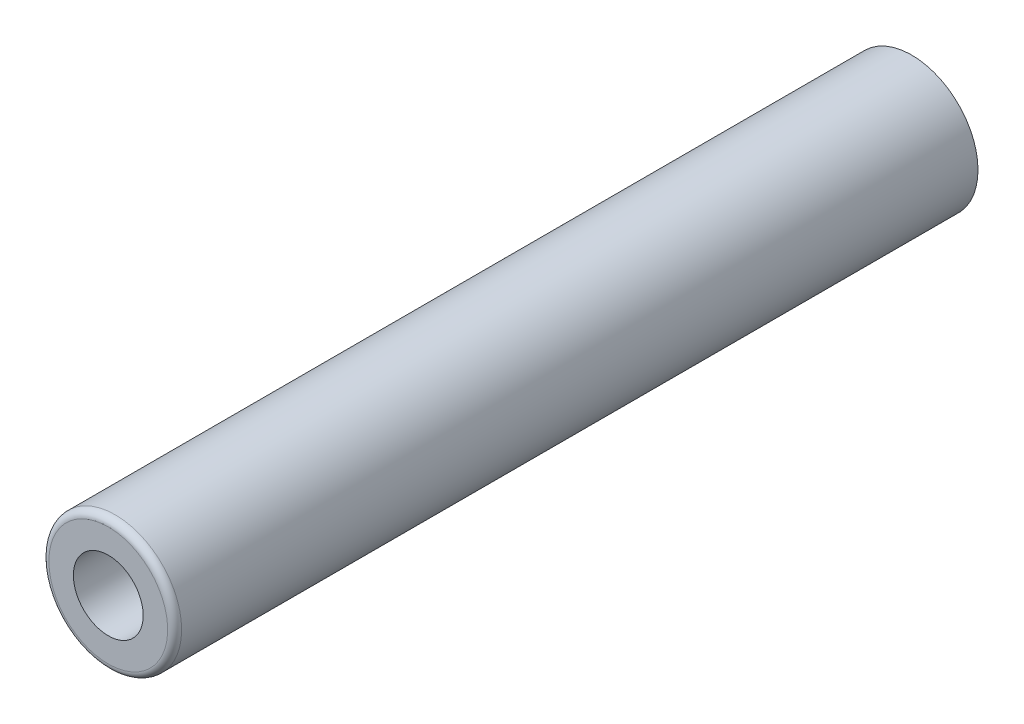
ISO-10303-21;
HEADER;
FILE_DESCRIPTION(('STEP AP214'),'2;1');
FILE_NAME('part.step','',(''),(''),'','','');
FILE_SCHEMA(('AUTOMOTIVE_DESIGN { 1 0 10303 214 1 1 1 1 }'));
ENDSEC;
DATA;
#1=APPLICATION_CONTEXT('core data for automotive mechanical design processes');
#2=APPLICATION_PROTOCOL_DEFINITION('international standard','automotive_design',2000,#1);
#3=PRODUCT_CONTEXT('',#1,'mechanical');
#4=PRODUCT('Part','Part','',(#3));
#5=PRODUCT_RELATED_PRODUCT_CATEGORY('part','',(#4));
#6=PRODUCT_DEFINITION_FORMATION('','',#4);
#7=PRODUCT_DEFINITION_CONTEXT('part definition',#1,'design');
#8=PRODUCT_DEFINITION('design','',#6,#7);
#9=PRODUCT_DEFINITION_SHAPE('','',#8);
#10=(LENGTH_UNIT() NAMED_UNIT(*) SI_UNIT(.MILLI.,.METRE.));
#11=(NAMED_UNIT(*) PLANE_ANGLE_UNIT() SI_UNIT($,.RADIAN.));
#12=(NAMED_UNIT(*) SI_UNIT($,.STERADIAN.) SOLID_ANGLE_UNIT());
#13=UNCERTAINTY_MEASURE_WITH_UNIT(LENGTH_MEASURE(1.E-05),#10,'distance_accuracy_value','');
#14=(GEOMETRIC_REPRESENTATION_CONTEXT(3) GLOBAL_UNCERTAINTY_ASSIGNED_CONTEXT((#13)) GLOBAL_UNIT_ASSIGNED_CONTEXT((#10,
#11,#12)) REPRESENTATION_CONTEXT('',''));
#15=CARTESIAN_POINT('',(0.,0.,0.));
#16=DIRECTION('',(0.,0.,1.));
#17=DIRECTION('',(1.,0.,0.));
#18=AXIS2_PLACEMENT_3D('',#15,#16,#17);
#19=CARTESIAN_POINT('',(0.,0.,319.317365215732));
#20=DIRECTION('',(0.,0.,1.));
#21=DIRECTION('',(1.,0.,0.));
#22=AXIS2_PLACEMENT_3D('',#19,#20,#21);
#23=CYLINDRICAL_SURFACE('',#22,19.0000000000001);
#24=CARTESIAN_POINT('',(0.,0.,113.));
#25=DIRECTION('',(0.,0.,-1.));
#26=DIRECTION('',(-1.,0.,0.));
#27=AXIS2_PLACEMENT_3D('',#24,#25,#26);
#28=CIRCLE('',#27,19.0000000000001);
#29=CARTESIAN_POINT('',(-19.0000000000001,0.,113.));
#30=VERTEX_POINT('',#29);
#31=EDGE_CURVE('E10',#30,#30,#28,.T.);
#32=ORIENTED_EDGE('',*,*,#31,.T.);
#33=EDGE_LOOP('',(#32));
#34=FACE_BOUND('',#33,.T.);
#35=CARTESIAN_POINT('',(0.,0.,-115.));
#36=DIRECTION('',(0.,0.,1.));
#37=DIRECTION('',(1.,0.,0.));
#38=AXIS2_PLACEMENT_3D('',#35,#36,#37);
#39=CIRCLE('',#38,19.0000000000001);
#40=CARTESIAN_POINT('',(19.0000000000001,0.,-115.));
#41=VERTEX_POINT('',#40);
#42=EDGE_CURVE('E49',#41,#41,#39,.T.);
#43=ORIENTED_EDGE('',*,*,#42,.T.);
#44=EDGE_LOOP('',(#43));
#45=FACE_BOUND('',#44,.T.);
#46=ADVANCED_FACE('F39',(#34,#45),#23,.T.);
#47=CARTESIAN_POINT('',(0.,19.0000000000001,-115.));
#48=DIRECTION('',(0.,0.,1.));
#49=DIRECTION('',(1.,0.,0.));
#50=AXIS2_PLACEMENT_3D('',#47,#48,#49);
#51=PLANE('',#50);
#52=ORIENTED_EDGE('',*,*,#42,.F.);
#53=EDGE_LOOP('',(#52));
#54=FACE_BOUND('',#53,.T.);
#55=CARTESIAN_POINT('',(0.,0.,-115.));
#56=DIRECTION('',(0.,0.,1.));
#57=DIRECTION('',(1.,0.,0.));
#58=AXIS2_PLACEMENT_3D('',#55,#56,#57);
#59=CIRCLE('',#58,15.0000000000001);
#60=CARTESIAN_POINT('',(15.0000000000001,0.,-115.));
#61=VERTEX_POINT('',#60);
#62=EDGE_CURVE('E53',#61,#61,#59,.T.);
#63=ORIENTED_EDGE('',*,*,#62,.T.);
#64=EDGE_LOOP('',(#63));
#65=FACE_BOUND('',#64,.T.);
#66=ADVANCED_FACE('F84',(#54,#65),#51,.F.);
#67=CARTESIAN_POINT('',(0.,0.,319.317365215732));
#68=DIRECTION('',(0.,0.,1.));
#69=DIRECTION('',(1.,0.,0.));
#70=AXIS2_PLACEMENT_3D('',#67,#68,#69);
#71=CYLINDRICAL_SURFACE('',#70,15.0000000000001);
#72=ORIENTED_EDGE('',*,*,#62,.F.);
#73=EDGE_LOOP('',(#72));
#74=FACE_BOUND('',#73,.T.);
#75=CARTESIAN_POINT('',(0.,0.,75.));
#76=DIRECTION('',(0.,0.,1.));
#77=DIRECTION('',(1.,0.,0.));
#78=AXIS2_PLACEMENT_3D('',#75,#76,#77);
#79=CIRCLE('',#78,15.0000000000001);
#80=CARTESIAN_POINT('',(15.0000000000001,0.,75.));
#81=VERTEX_POINT('',#80);
#82=EDGE_CURVE('E56',#81,#81,#79,.T.);
#83=ORIENTED_EDGE('',*,*,#82,.T.);
#84=EDGE_LOOP('',(#83));
#85=FACE_BOUND('',#84,.T.);
#86=ADVANCED_FACE('F87',(#74,#85),#71,.F.);
#87=CARTESIAN_POINT('',(0.,10.,75.));
#88=DIRECTION('',(0.,0.,1.));
#89=DIRECTION('',(1.,0.,0.));
#90=AXIS2_PLACEMENT_3D('',#87,#88,#89);
#91=PLANE('',#90);
#92=ORIENTED_EDGE('',*,*,#82,.F.);
#93=EDGE_LOOP('',(#92));
#94=FACE_BOUND('',#93,.T.);
#95=CARTESIAN_POINT('',(0.,0.,75.));
#96=DIRECTION('',(0.,0.,1.));
#97=DIRECTION('',(1.,0.,0.));
#98=AXIS2_PLACEMENT_3D('',#95,#96,#97);
#99=CIRCLE('',#98,10.);
#100=CARTESIAN_POINT('',(10.,0.,75.));
#101=VERTEX_POINT('',#100);
#102=EDGE_CURVE('E61',#101,#101,#99,.T.);
#103=ORIENTED_EDGE('',*,*,#102,.T.);
#104=EDGE_LOOP('',(#103));
#105=FACE_BOUND('',#104,.T.);
#106=ADVANCED_FACE('F77',(#94,#105),#91,.F.);
#107=CARTESIAN_POINT('',(0.,0.,319.317365215732));
#108=DIRECTION('',(0.,0.,1.));
#109=DIRECTION('',(1.,0.,0.));
#110=AXIS2_PLACEMENT_3D('',#107,#108,#109);
#111=CYLINDRICAL_SURFACE('',#110,10.);
#112=ORIENTED_EDGE('',*,*,#102,.F.);
#113=EDGE_LOOP('',(#112));
#114=FACE_BOUND('',#113,.T.);
#115=CARTESIAN_POINT('',(0.,0.,115.));
#116=DIRECTION('',(0.,0.,1.));
#117=DIRECTION('',(1.,0.,0.));
#118=AXIS2_PLACEMENT_3D('',#115,#116,#117);
#119=CIRCLE('',#118,10.);
#120=CARTESIAN_POINT('',(10.,0.,115.));
#121=VERTEX_POINT('',#120);
#122=EDGE_CURVE('E62',#121,#121,#119,.T.);
#123=ORIENTED_EDGE('',*,*,#122,.T.);
#124=EDGE_LOOP('',(#123));
#125=FACE_BOUND('',#124,.T.);
#126=ADVANCED_FACE('F68',(#114,#125),#111,.F.);
#127=CARTESIAN_POINT('',(0.,10.,115.));
#128=DIRECTION('',(0.,0.,-1.));
#129=DIRECTION('',(-1.,0.,0.));
#130=AXIS2_PLACEMENT_3D('',#127,#128,#129);
#131=PLANE('',#130);
#132=CARTESIAN_POINT('',(0.,0.,115.));
#133=DIRECTION('',(0.,0.,-1.));
#134=DIRECTION('',(-1.,0.,0.));
#135=AXIS2_PLACEMENT_3D('',#132,#133,#134);
#136=CIRCLE('',#135,17.0000000000001);
#137=CARTESIAN_POINT('',(-17.0000000000001,0.,115.));
#138=VERTEX_POINT('',#137);
#139=EDGE_CURVE('E46',#138,#138,#136,.F.);
#140=ORIENTED_EDGE('',*,*,#139,.T.);
#141=EDGE_LOOP('',(#140));
#142=FACE_BOUND('',#141,.T.);
#143=ORIENTED_EDGE('',*,*,#122,.F.);
#144=EDGE_LOOP('',(#143));
#145=FACE_BOUND('',#144,.T.);
#146=ADVANCED_FACE('F72',(#142,#145),#131,.F.);
#147=CARTESIAN_POINT('',(0.,0.,113.));
#148=DIRECTION('',(0.,0.,-1.));
#149=DIRECTION('',(-1.,0.,0.));
#150=AXIS2_PLACEMENT_3D('',#147,#148,#149);
#151=TOROIDAL_SURFACE('',#150,17.0000000000001,2.);
#152=ORIENTED_EDGE('',*,*,#31,.F.);
#153=EDGE_LOOP('',(#152));
#154=FACE_BOUND('',#153,.T.);
#155=ORIENTED_EDGE('',*,*,#139,.F.);
#156=EDGE_LOOP('',(#155));
#157=FACE_BOUND('',#156,.T.);
#158=ADVANCED_FACE('F41',(#154,#157),#151,.T.);
#159=CLOSED_SHELL('',(#46,#66,#86,#106,#126,#146,#158));
#160=MANIFOLD_SOLID_BREP('B2',#159);
#161=ADVANCED_BREP_SHAPE_REPRESENTATION('',(#18,#160),#14);
#162=SHAPE_DEFINITION_REPRESENTATION(#9,#161);
ENDSEC;
END-ISO-10303-21;
